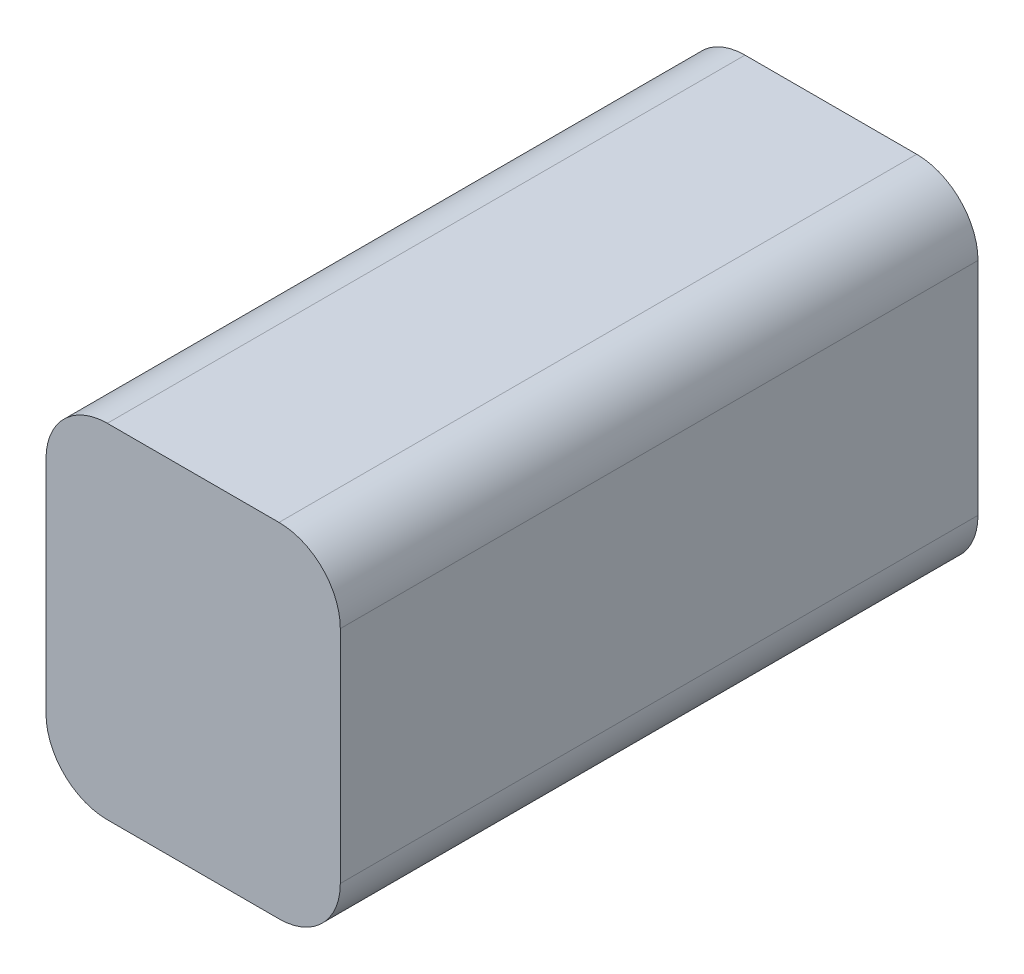
ISO-10303-21;
HEADER;
FILE_DESCRIPTION(('STEP AP214'),'2;1');
FILE_NAME('part.step','',(''),(''),'','','');
FILE_SCHEMA(('AUTOMOTIVE_DESIGN { 1 0 10303 214 1 1 1 1 }'));
ENDSEC;
DATA;
#1=APPLICATION_CONTEXT('core data for automotive mechanical design processes');
#2=APPLICATION_PROTOCOL_DEFINITION('international standard','automotive_design',2000,#1);
#3=PRODUCT_CONTEXT('',#1,'mechanical');
#4=PRODUCT('Part','Part','',(#3));
#5=PRODUCT_RELATED_PRODUCT_CATEGORY('part','',(#4));
#6=PRODUCT_DEFINITION_FORMATION('','',#4);
#7=PRODUCT_DEFINITION_CONTEXT('part definition',#1,'design');
#8=PRODUCT_DEFINITION('design','',#6,#7);
#9=PRODUCT_DEFINITION_SHAPE('','',#8);
#10=(LENGTH_UNIT() NAMED_UNIT(*) SI_UNIT(.MILLI.,.METRE.));
#11=(NAMED_UNIT(*) PLANE_ANGLE_UNIT() SI_UNIT($,.RADIAN.));
#12=(NAMED_UNIT(*) SI_UNIT($,.STERADIAN.) SOLID_ANGLE_UNIT());
#13=UNCERTAINTY_MEASURE_WITH_UNIT(LENGTH_MEASURE(1.E-05),#10,'distance_accuracy_value','');
#14=(GEOMETRIC_REPRESENTATION_CONTEXT(3) GLOBAL_UNCERTAINTY_ASSIGNED_CONTEXT((#13)) GLOBAL_UNIT_ASSIGNED_CONTEXT((#10,
#11,#12)) REPRESENTATION_CONTEXT('',''));
#15=CARTESIAN_POINT('',(0.,0.,0.));
#16=DIRECTION('',(0.,0.,1.));
#17=DIRECTION('',(1.,0.,0.));
#18=AXIS2_PLACEMENT_3D('',#15,#16,#17);
#19=CARTESIAN_POINT('',(12.,28.,26.));
#20=DIRECTION('',(-1.,0.,0.));
#21=DIRECTION('',(0.,0.,1.));
#22=AXIS2_PLACEMENT_3D('',#19,#20,#21);
#23=PLANE('',#22);
#24=DIRECTION('',(0.,-1.,0.));
#25=VECTOR('',#24,1.);
#26=CARTESIAN_POINT('',(12.,28.,26.));
#27=LINE('',#26,#25);
#28=CARTESIAN_POINT('',(12.,23.,26.));
#29=VERTEX_POINT('',#28);
#30=CARTESIAN_POINT('',(12.,5.,26.));
#31=VERTEX_POINT('',#30);
#32=EDGE_CURVE('E122',#29,#31,#27,.T.);
#33=ORIENTED_EDGE('',*,*,#32,.T.);
#34=DIRECTION('',(0.,0.,-1.));
#35=VECTOR('',#34,1.);
#36=CARTESIAN_POINT('',(12.,5.,-26.));
#37=LINE('',#36,#35);
#38=CARTESIAN_POINT('',(12.,5.,-26.));
#39=VERTEX_POINT('',#38);
#40=EDGE_CURVE('E148',#31,#39,#37,.T.);
#41=ORIENTED_EDGE('',*,*,#40,.T.);
#42=DIRECTION('',(0.,-1.,0.));
#43=VECTOR('',#42,1.);
#44=CARTESIAN_POINT('',(12.,28.,-26.));
#45=LINE('',#44,#43);
#46=CARTESIAN_POINT('',(12.,23.,-26.));
#47=VERTEX_POINT('',#46);
#48=EDGE_CURVE('E127',#47,#39,#45,.T.);
#49=ORIENTED_EDGE('',*,*,#48,.F.);
#50=DIRECTION('',(0.,0.,-1.));
#51=VECTOR('',#50,1.);
#52=CARTESIAN_POINT('',(12.,23.,26.));
#53=LINE('',#52,#51);
#54=EDGE_CURVE('E146',#47,#29,#53,.F.);
#55=ORIENTED_EDGE('',*,*,#54,.T.);
#56=EDGE_LOOP('',(#33,#41,#49,#55));
#57=FACE_BOUND('',#56,.T.);
#58=ADVANCED_FACE('F34',(#57),#23,.F.);
#59=CARTESIAN_POINT('',(-12.,28.,-26.));
#60=DIRECTION('',(0.,0.,1.));
#61=DIRECTION('',(1.,0.,0.));
#62=AXIS2_PLACEMENT_3D('',#59,#60,#61);
#63=PLANE('',#62);
#64=DIRECTION('',(-1.,0.,0.));
#65=VECTOR('',#64,1.);
#66=CARTESIAN_POINT('',(-12.,0.,-26.));
#67=LINE('',#66,#65);
#68=CARTESIAN_POINT('',(7.,0.,-26.));
#69=VERTEX_POINT('',#68);
#70=CARTESIAN_POINT('',(-7.,0.,-26.));
#71=VERTEX_POINT('',#70);
#72=EDGE_CURVE('E163',#69,#71,#67,.T.);
#73=ORIENTED_EDGE('',*,*,#72,.T.);
#74=CARTESIAN_POINT('',(-7.,5.,-26.));
#75=DIRECTION('',(0.,0.,1.));
#76=DIRECTION('',(1.,0.,0.));
#77=AXIS2_PLACEMENT_3D('',#74,#75,#76);
#78=CIRCLE('',#77,5.);
#79=CARTESIAN_POINT('',(-12.,5.,-26.));
#80=VERTEX_POINT('',#79);
#81=EDGE_CURVE('E144',#71,#80,#78,.F.);
#82=ORIENTED_EDGE('',*,*,#81,.T.);
#83=DIRECTION('',(0.,-1.,0.));
#84=VECTOR('',#83,1.);
#85=CARTESIAN_POINT('',(-12.,28.,-26.));
#86=LINE('',#85,#84);
#87=CARTESIAN_POINT('',(-12.,23.,-26.));
#88=VERTEX_POINT('',#87);
#89=EDGE_CURVE('E121',#88,#80,#86,.T.);
#90=ORIENTED_EDGE('',*,*,#89,.F.);
#91=CARTESIAN_POINT('',(-7.,23.,-26.));
#92=DIRECTION('',(0.,0.,1.));
#93=DIRECTION('',(1.,0.,0.));
#94=AXIS2_PLACEMENT_3D('',#91,#92,#93);
#95=CIRCLE('',#94,5.);
#96=CARTESIAN_POINT('',(-7.,28.,-26.));
#97=VERTEX_POINT('',#96);
#98=EDGE_CURVE('E126',#88,#97,#95,.F.);
#99=ORIENTED_EDGE('',*,*,#98,.T.);
#100=DIRECTION('',(-1.,0.,0.));
#101=VECTOR('',#100,1.);
#102=CARTESIAN_POINT('',(-12.,28.,-26.));
#103=LINE('',#102,#101);
#104=CARTESIAN_POINT('',(7.,28.,-26.));
#105=VERTEX_POINT('',#104);
#106=EDGE_CURVE('E154',#105,#97,#103,.T.);
#107=ORIENTED_EDGE('',*,*,#106,.F.);
#108=CARTESIAN_POINT('',(7.,23.,-26.));
#109=DIRECTION('',(0.,0.,1.));
#110=DIRECTION('',(1.,0.,0.));
#111=AXIS2_PLACEMENT_3D('',#108,#109,#110);
#112=CIRCLE('',#111,5.);
#113=EDGE_CURVE('E57',#105,#47,#112,.F.);
#114=ORIENTED_EDGE('',*,*,#113,.T.);
#115=ORIENTED_EDGE('',*,*,#48,.T.);
#116=CARTESIAN_POINT('',(7.,5.,-26.));
#117=DIRECTION('',(0.,0.,1.));
#118=DIRECTION('',(1.,0.,0.));
#119=AXIS2_PLACEMENT_3D('',#116,#117,#118);
#120=CIRCLE('',#119,5.);
#121=EDGE_CURVE('E49',#39,#69,#120,.F.);
#122=ORIENTED_EDGE('',*,*,#121,.T.);
#123=EDGE_LOOP('',(#73,#82,#90,#99,#107,#114,#115,#122));
#124=FACE_BOUND('',#123,.T.);
#125=ADVANCED_FACE('F158',(#124),#63,.F.);
#126=CARTESIAN_POINT('',(-12.,28.,26.));
#127=DIRECTION('',(1.,0.,0.));
#128=DIRECTION('',(0.,0.,-1.));
#129=AXIS2_PLACEMENT_3D('',#126,#127,#128);
#130=PLANE('',#129);
#131=ORIENTED_EDGE('',*,*,#89,.T.);
#132=DIRECTION('',(0.,0.,1.));
#133=VECTOR('',#132,1.);
#134=CARTESIAN_POINT('',(-12.,5.,26.));
#135=LINE('',#134,#133);
#136=CARTESIAN_POINT('',(-12.,5.,26.));
#137=VERTEX_POINT('',#136);
#138=EDGE_CURVE('E120',#80,#137,#135,.T.);
#139=ORIENTED_EDGE('',*,*,#138,.T.);
#140=DIRECTION('',(0.,-1.,0.));
#141=VECTOR('',#140,1.);
#142=CARTESIAN_POINT('',(-12.,28.,26.));
#143=LINE('',#142,#141);
#144=CARTESIAN_POINT('',(-12.,23.,26.));
#145=VERTEX_POINT('',#144);
#146=EDGE_CURVE('E104',#145,#137,#143,.T.);
#147=ORIENTED_EDGE('',*,*,#146,.F.);
#148=DIRECTION('',(0.,0.,1.));
#149=VECTOR('',#148,1.);
#150=CARTESIAN_POINT('',(-12.,23.,26.));
#151=LINE('',#150,#149);
#152=EDGE_CURVE('E117',#145,#88,#151,.F.);
#153=ORIENTED_EDGE('',*,*,#152,.T.);
#154=EDGE_LOOP('',(#131,#139,#147,#153));
#155=FACE_BOUND('',#154,.T.);
#156=ADVANCED_FACE('F116',(#155),#130,.F.);
#157=CARTESIAN_POINT('',(-12.,28.,26.));
#158=DIRECTION('',(0.,0.,-1.));
#159=DIRECTION('',(-1.,0.,0.));
#160=AXIS2_PLACEMENT_3D('',#157,#158,#159);
#161=PLANE('',#160);
#162=ORIENTED_EDGE('',*,*,#146,.T.);
#163=CARTESIAN_POINT('',(-7.,5.,26.));
#164=DIRECTION('',(0.,0.,-1.));
#165=DIRECTION('',(-1.,0.,0.));
#166=AXIS2_PLACEMENT_3D('',#163,#164,#165);
#167=CIRCLE('',#166,5.);
#168=CARTESIAN_POINT('',(-7.,0.,26.));
#169=VERTEX_POINT('',#168);
#170=EDGE_CURVE('E135',#137,#169,#167,.F.);
#171=ORIENTED_EDGE('',*,*,#170,.T.);
#172=DIRECTION('',(1.,0.,0.));
#173=VECTOR('',#172,1.);
#174=CARTESIAN_POINT('',(-12.,0.,26.));
#175=LINE('',#174,#173);
#176=CARTESIAN_POINT('',(7.,0.,26.));
#177=VERTEX_POINT('',#176);
#178=EDGE_CURVE('E159',#169,#177,#175,.T.);
#179=ORIENTED_EDGE('',*,*,#178,.T.);
#180=CARTESIAN_POINT('',(7.,5.,26.));
#181=DIRECTION('',(0.,0.,-1.));
#182=DIRECTION('',(-1.,0.,0.));
#183=AXIS2_PLACEMENT_3D('',#180,#181,#182);
#184=CIRCLE('',#183,5.);
#185=EDGE_CURVE('E110',#177,#31,#184,.F.);
#186=ORIENTED_EDGE('',*,*,#185,.T.);
#187=ORIENTED_EDGE('',*,*,#32,.F.);
#188=CARTESIAN_POINT('',(7.,23.,26.));
#189=DIRECTION('',(0.,0.,-1.));
#190=DIRECTION('',(-1.,0.,0.));
#191=AXIS2_PLACEMENT_3D('',#188,#189,#190);
#192=CIRCLE('',#191,5.);
#193=CARTESIAN_POINT('',(7.,28.,26.));
#194=VERTEX_POINT('',#193);
#195=EDGE_CURVE('E111',#29,#194,#192,.F.);
#196=ORIENTED_EDGE('',*,*,#195,.T.);
#197=DIRECTION('',(1.,0.,0.));
#198=VECTOR('',#197,1.);
#199=CARTESIAN_POINT('',(-12.,28.,26.));
#200=LINE('',#199,#198);
#201=CARTESIAN_POINT('',(-7.,28.,26.));
#202=VERTEX_POINT('',#201);
#203=EDGE_CURVE('E106',#202,#194,#200,.T.);
#204=ORIENTED_EDGE('',*,*,#203,.F.);
#205=CARTESIAN_POINT('',(-7.,23.,26.));
#206=DIRECTION('',(0.,0.,-1.));
#207=DIRECTION('',(-1.,0.,0.));
#208=AXIS2_PLACEMENT_3D('',#205,#206,#207);
#209=CIRCLE('',#208,5.);
#210=EDGE_CURVE('E101',#202,#145,#209,.F.);
#211=ORIENTED_EDGE('',*,*,#210,.T.);
#212=EDGE_LOOP('',(#162,#171,#179,#186,#187,#196,#204,#211));
#213=FACE_BOUND('',#212,.T.);
#214=ADVANCED_FACE('F103',(#213),#161,.F.);
#215=CARTESIAN_POINT('',(0.,28.,0.));
#216=DIRECTION('',(0.,-1.,0.));
#217=DIRECTION('',(0.,0.,-1.));
#218=AXIS2_PLACEMENT_3D('',#215,#216,#217);
#219=PLANE('',#218);
#220=ORIENTED_EDGE('',*,*,#106,.T.);
#221=DIRECTION('',(0.,0.,1.));
#222=VECTOR('',#221,1.);
#223=CARTESIAN_POINT('',(-7.,28.,0.));
#224=LINE('',#223,#222);
#225=EDGE_CURVE('E11',#97,#202,#224,.T.);
#226=ORIENTED_EDGE('',*,*,#225,.T.);
#227=ORIENTED_EDGE('',*,*,#203,.T.);
#228=DIRECTION('',(0.,0.,-1.));
#229=VECTOR('',#228,1.);
#230=CARTESIAN_POINT('',(7.,28.,0.));
#231=LINE('',#230,#229);
#232=EDGE_CURVE('E42',#194,#105,#231,.T.);
#233=ORIENTED_EDGE('',*,*,#232,.T.);
#234=EDGE_LOOP('',(#220,#226,#227,#233));
#235=FACE_BOUND('',#234,.T.);
#236=ADVANCED_FACE('F153',(#235),#219,.F.);
#237=CARTESIAN_POINT('',(0.,0.,0.));
#238=DIRECTION('',(0.,-1.,0.));
#239=DIRECTION('',(0.,0.,-1.));
#240=AXIS2_PLACEMENT_3D('',#237,#238,#239);
#241=PLANE('',#240);
#242=ORIENTED_EDGE('',*,*,#178,.F.);
#243=DIRECTION('',(0.,0.,1.));
#244=VECTOR('',#243,1.);
#245=CARTESIAN_POINT('',(-7.,0.,-26.));
#246=LINE('',#245,#244);
#247=EDGE_CURVE('E139',#169,#71,#246,.F.);
#248=ORIENTED_EDGE('',*,*,#247,.T.);
#249=ORIENTED_EDGE('',*,*,#72,.F.);
#250=DIRECTION('',(0.,0.,-1.));
#251=VECTOR('',#250,1.);
#252=CARTESIAN_POINT('',(7.,0.,26.));
#253=LINE('',#252,#251);
#254=EDGE_CURVE('E137',#69,#177,#253,.F.);
#255=ORIENTED_EDGE('',*,*,#254,.T.);
#256=EDGE_LOOP('',(#242,#248,#249,#255));
#257=FACE_BOUND('',#256,.T.);
#258=ADVANCED_FACE('F175',(#257),#241,.T.);
#259=CARTESIAN_POINT('',(-7.,5.,26.));
#260=DIRECTION('',(0.,0.,-1.));
#261=DIRECTION('',(-1.,0.,0.));
#262=AXIS2_PLACEMENT_3D('',#259,#260,#261);
#263=CYLINDRICAL_SURFACE('',#262,5.);
#264=ORIENTED_EDGE('',*,*,#81,.F.);
#265=ORIENTED_EDGE('',*,*,#247,.F.);
#266=ORIENTED_EDGE('',*,*,#170,.F.);
#267=ORIENTED_EDGE('',*,*,#138,.F.);
#268=EDGE_LOOP('',(#264,#265,#266,#267));
#269=FACE_BOUND('',#268,.T.);
#270=ADVANCED_FACE('F170',(#269),#263,.T.);
#271=CARTESIAN_POINT('',(7.,5.,26.));
#272=DIRECTION('',(0.,0.,1.));
#273=DIRECTION('',(1.,0.,0.));
#274=AXIS2_PLACEMENT_3D('',#271,#272,#273);
#275=CYLINDRICAL_SURFACE('',#274,5.);
#276=ORIENTED_EDGE('',*,*,#185,.F.);
#277=ORIENTED_EDGE('',*,*,#254,.F.);
#278=ORIENTED_EDGE('',*,*,#121,.F.);
#279=ORIENTED_EDGE('',*,*,#40,.F.);
#280=EDGE_LOOP('',(#276,#277,#278,#279));
#281=FACE_BOUND('',#280,.T.);
#282=ADVANCED_FACE('F177',(#281),#275,.T.);
#283=CARTESIAN_POINT('',(-7.,23.,0.));
#284=DIRECTION('',(0.,0.,1.));
#285=DIRECTION('',(1.,0.,0.));
#286=AXIS2_PLACEMENT_3D('',#283,#284,#285);
#287=CYLINDRICAL_SURFACE('',#286,5.);
#288=ORIENTED_EDGE('',*,*,#98,.F.);
#289=ORIENTED_EDGE('',*,*,#152,.F.);
#290=ORIENTED_EDGE('',*,*,#210,.F.);
#291=ORIENTED_EDGE('',*,*,#225,.F.);
#292=EDGE_LOOP('',(#288,#289,#290,#291));
#293=FACE_BOUND('',#292,.T.);
#294=ADVANCED_FACE('F125',(#293),#287,.T.);
#295=CARTESIAN_POINT('',(7.,23.,0.));
#296=DIRECTION('',(0.,0.,-1.));
#297=DIRECTION('',(-1.,0.,0.));
#298=AXIS2_PLACEMENT_3D('',#295,#296,#297);
#299=CYLINDRICAL_SURFACE('',#298,5.);
#300=ORIENTED_EDGE('',*,*,#195,.F.);
#301=ORIENTED_EDGE('',*,*,#54,.F.);
#302=ORIENTED_EDGE('',*,*,#113,.F.);
#303=ORIENTED_EDGE('',*,*,#232,.F.);
#304=EDGE_LOOP('',(#300,#301,#302,#303));
#305=FACE_BOUND('',#304,.T.);
#306=ADVANCED_FACE('F36',(#305),#299,.T.);
#307=CLOSED_SHELL('',(#58,#125,#156,#214,#236,#258,#270,#282,#294,#306));
#308=MANIFOLD_SOLID_BREP('B2',#307);
#309=ADVANCED_BREP_SHAPE_REPRESENTATION('',(#18,#308),#14);
#310=SHAPE_DEFINITION_REPRESENTATION(#9,#309);
ENDSEC;
END-ISO-10303-21;
